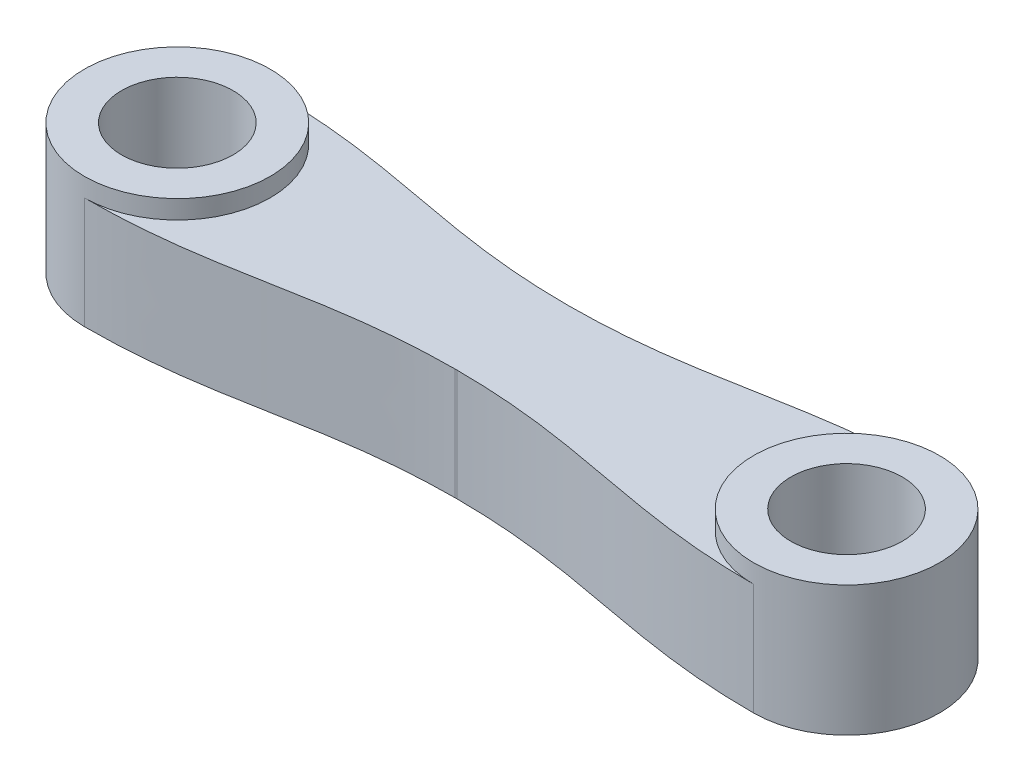
ISO-10303-21;
HEADER;
FILE_DESCRIPTION(('STEP AP214'),'2;1');
FILE_NAME('part.step','',(''),(''),'','','');
FILE_SCHEMA(('AUTOMOTIVE_DESIGN { 1 0 10303 214 1 1 1 1 }'));
ENDSEC;
DATA;
#1=APPLICATION_CONTEXT('core data for automotive mechanical design processes');
#2=APPLICATION_PROTOCOL_DEFINITION('international standard','automotive_design',2000,#1);
#3=PRODUCT_CONTEXT('',#1,'mechanical');
#4=PRODUCT('Part','Part','',(#3));
#5=PRODUCT_RELATED_PRODUCT_CATEGORY('part','',(#4));
#6=PRODUCT_DEFINITION_FORMATION('','',#4);
#7=PRODUCT_DEFINITION_CONTEXT('part definition',#1,'design');
#8=PRODUCT_DEFINITION('design','',#6,#7);
#9=PRODUCT_DEFINITION_SHAPE('','',#8);
#10=(LENGTH_UNIT() NAMED_UNIT(*) SI_UNIT(.MILLI.,.METRE.));
#11=(NAMED_UNIT(*) PLANE_ANGLE_UNIT() SI_UNIT($,.RADIAN.));
#12=(NAMED_UNIT(*) SI_UNIT($,.STERADIAN.) SOLID_ANGLE_UNIT());
#13=UNCERTAINTY_MEASURE_WITH_UNIT(LENGTH_MEASURE(1.E-05),#10,'distance_accuracy_value','');
#14=(GEOMETRIC_REPRESENTATION_CONTEXT(3) GLOBAL_UNCERTAINTY_ASSIGNED_CONTEXT((#13)) GLOBAL_UNIT_ASSIGNED_CONTEXT((#10,
#11,#12)) REPRESENTATION_CONTEXT('',''));
#15=CARTESIAN_POINT('',(0.,0.,0.));
#16=DIRECTION('',(0.,0.,1.));
#17=DIRECTION('',(1.,0.,0.));
#18=AXIS2_PLACEMENT_3D('',#15,#16,#17);
#19=CARTESIAN_POINT('',(-9.,3.5,0.));
#20=DIRECTION('',(0.,-1.,0.));
#21=DIRECTION('',(0.,0.,-1.));
#22=AXIS2_PLACEMENT_3D('',#19,#20,#21);
#23=CYLINDRICAL_SURFACE('',#22,2.5);
#24=CARTESIAN_POINT('',(-9.,3.5,0.));
#25=DIRECTION('',(0.,1.,0.));
#26=DIRECTION('',(0.,0.,1.));
#27=AXIS2_PLACEMENT_3D('',#24,#25,#26);
#28=CIRCLE('',#27,2.5);
#29=CARTESIAN_POINT('',(-9.,3.5,2.5));
#30=VERTEX_POINT('',#29);
#31=EDGE_CURVE('E202',#30,#30,#28,.T.);
#32=ORIENTED_EDGE('',*,*,#31,.F.);
#33=EDGE_LOOP('',(#32));
#34=FACE_BOUND('',#33,.T.);
#35=DIRECTION('',(0.,-1.,0.));
#36=VECTOR('',#35,1.);
#37=CARTESIAN_POINT('',(-9.,3.,2.5));
#38=LINE('',#37,#36);
#39=CARTESIAN_POINT('',(-9.,3.,2.5));
#40=VERTEX_POINT('',#39);
#41=CARTESIAN_POINT('',(-9.,0.,2.5));
#42=VERTEX_POINT('',#41);
#43=EDGE_CURVE('E121',#40,#42,#38,.T.);
#44=ORIENTED_EDGE('',*,*,#43,.F.);
#45=CARTESIAN_POINT('',(-9.,3.,0.));
#46=DIRECTION('',(0.,1.,0.));
#47=DIRECTION('',(0.,0.,1.));
#48=AXIS2_PLACEMENT_3D('',#45,#46,#47);
#49=CIRCLE('',#48,2.5);
#50=CARTESIAN_POINT('',(-9.,3.,-2.5));
#51=VERTEX_POINT('',#50);
#52=EDGE_CURVE('E164',#40,#51,#49,.T.);
#53=ORIENTED_EDGE('',*,*,#52,.T.);
#54=DIRECTION('',(0.,-1.,0.));
#55=VECTOR('',#54,1.);
#56=CARTESIAN_POINT('',(-9.,3.,-2.5));
#57=LINE('',#56,#55);
#58=CARTESIAN_POINT('',(-9.,0.,-2.5));
#59=VERTEX_POINT('',#58);
#60=EDGE_CURVE('E231',#51,#59,#57,.T.);
#61=ORIENTED_EDGE('',*,*,#60,.T.);
#62=CARTESIAN_POINT('',(-9.,0.,0.));
#63=DIRECTION('',(0.,1.,0.));
#64=DIRECTION('',(0.,0.,1.));
#65=AXIS2_PLACEMENT_3D('',#62,#63,#64);
#66=CIRCLE('',#65,2.5);
#67=EDGE_CURVE('E205',#59,#42,#66,.T.);
#68=ORIENTED_EDGE('',*,*,#67,.T.);
#69=EDGE_LOOP('',(#44,#53,#61,#68));
#70=FACE_BOUND('',#69,.T.);
#71=ADVANCED_FACE('F35',(#34,#70),#23,.T.);
#72=CARTESIAN_POINT('',(0.,3.5,0.));
#73=DIRECTION('',(0.,1.,0.));
#74=DIRECTION('',(0.,0.,1.));
#75=AXIS2_PLACEMENT_3D('',#72,#73,#74);
#76=PLANE('',#75);
#77=CARTESIAN_POINT('',(-9.,3.5,0.));
#78=DIRECTION('',(0.,1.,0.));
#79=DIRECTION('',(0.,0.,1.));
#80=AXIS2_PLACEMENT_3D('',#77,#78,#79);
#81=CIRCLE('',#80,1.5);
#82=CARTESIAN_POINT('',(-9.,3.5,1.5));
#83=VERTEX_POINT('',#82);
#84=EDGE_CURVE('E183',#83,#83,#81,.T.);
#85=ORIENTED_EDGE('',*,*,#84,.F.);
#86=EDGE_LOOP('',(#85));
#87=FACE_BOUND('',#86,.T.);
#88=ORIENTED_EDGE('',*,*,#31,.T.);
#89=EDGE_LOOP('',(#88));
#90=FACE_BOUND('',#89,.T.);
#91=ADVANCED_FACE('F158',(#87,#90),#76,.T.);
#92=CARTESIAN_POINT('',(0.,0.,0.));
#93=DIRECTION('',(0.,1.,0.));
#94=DIRECTION('',(0.,0.,1.));
#95=AXIS2_PLACEMENT_3D('',#92,#93,#94);
#96=PLANE('',#95);
#97=CARTESIAN_POINT('',(-9.,0.,0.));
#98=DIRECTION('',(0.,1.,0.));
#99=DIRECTION('',(0.,0.,1.));
#100=AXIS2_PLACEMENT_3D('',#97,#98,#99);
#101=CIRCLE('',#100,1.5);
#102=CARTESIAN_POINT('',(-9.,0.,1.5));
#103=VERTEX_POINT('',#102);
#104=EDGE_CURVE('E173',#103,#103,#101,.T.);
#105=ORIENTED_EDGE('',*,*,#104,.T.);
#106=EDGE_LOOP('',(#105));
#107=FACE_BOUND('',#106,.T.);
#108=CARTESIAN_POINT('',(9.,0.,0.));
#109=DIRECTION('',(0.,1.,0.));
#110=DIRECTION('',(0.,0.,-1.));
#111=AXIS2_PLACEMENT_3D('',#108,#109,#110);
#112=CIRCLE('',#111,1.5);
#113=CARTESIAN_POINT('',(9.,0.,-1.5));
#114=VERTEX_POINT('',#113);
#115=EDGE_CURVE('E180',#114,#114,#112,.T.);
#116=ORIENTED_EDGE('',*,*,#115,.T.);
#117=EDGE_LOOP('',(#116));
#118=FACE_BOUND('',#117,.T.);
#119=ORIENTED_EDGE('',*,*,#67,.F.);
#120=CARTESIAN_POINT('',(-9.,0.,-2.5));
#121=CARTESIAN_POINT('',(-5.42583167928752,0.,-2.5));
#122=CARTESIAN_POINT('',(-3.59903871905224,0.,-1.50458369189798));
#123=CARTESIAN_POINT('',(0.,0.,-1.5));
#124=B_SPLINE_CURVE_WITH_KNOTS('',3,(#120,#121,#122,#123),.UNSPECIFIED.,.F.,.F.,(4,4),(0.,1.),.UNSPECIFIED.);
#125=CARTESIAN_POINT('',(-0.0260821857573528,0.,-1.50005061650803));
#126=VERTEX_POINT('',#125);
#127=EDGE_CURVE('E169',#59,#126,#124,.T.);
#128=ORIENTED_EDGE('',*,*,#127,.T.);
#129=CARTESIAN_POINT('',(0.,0.,-11.5000166024295));
#130=DIRECTION('',(0.,1.,0.));
#131=DIRECTION('',(0.,0.,1.));
#132=AXIS2_PLACEMENT_3D('',#129,#130,#131);
#133=CIRCLE('',#132,10.);
#134=CARTESIAN_POINT('',(0.0260821857573516,0.,-1.50005061650803));
#135=VERTEX_POINT('',#134);
#136=EDGE_CURVE('E217',#126,#135,#133,.T.);
#137=ORIENTED_EDGE('',*,*,#136,.T.);
#138=CARTESIAN_POINT('',(9.,0.,-2.5));
#139=CARTESIAN_POINT('',(5.42583167928752,0.,-2.5));
#140=CARTESIAN_POINT('',(3.59903871905224,0.,-1.50458369189798));
#141=CARTESIAN_POINT('',(0.,0.,-1.5));
#142=B_SPLINE_CURVE_WITH_KNOTS('',3,(#138,#139,#140,#141),.UNSPECIFIED.,.F.,.F.,(4,4),(0.,1.),.UNSPECIFIED.);
#143=CARTESIAN_POINT('',(9.,0.,-2.5));
#144=VERTEX_POINT('',#143);
#145=EDGE_CURVE('E235',#144,#135,#142,.T.);
#146=ORIENTED_EDGE('',*,*,#145,.F.);
#147=CARTESIAN_POINT('',(9.,0.,0.));
#148=DIRECTION('',(0.,1.,0.));
#149=DIRECTION('',(0.,0.,1.));
#150=AXIS2_PLACEMENT_3D('',#147,#148,#149);
#151=CIRCLE('',#150,2.5);
#152=CARTESIAN_POINT('',(9.,0.,2.5));
#153=VERTEX_POINT('',#152);
#154=EDGE_CURVE('E170',#153,#144,#151,.T.);
#155=ORIENTED_EDGE('',*,*,#154,.F.);
#156=CARTESIAN_POINT('',(9.,0.,2.5));
#157=CARTESIAN_POINT('',(5.42583167928752,0.,2.5));
#158=CARTESIAN_POINT('',(3.59903871905224,0.,1.50458369189798));
#159=CARTESIAN_POINT('',(0.,0.,1.5));
#160=B_SPLINE_CURVE_WITH_KNOTS('',3,(#156,#157,#158,#159),.UNSPECIFIED.,.F.,.F.,(4,4),(0.,1.),.UNSPECIFIED.);
#161=CARTESIAN_POINT('',(0.0260821857573528,0.,1.50005061650803));
#162=VERTEX_POINT('',#161);
#163=EDGE_CURVE('E117',#153,#162,#160,.T.);
#164=ORIENTED_EDGE('',*,*,#163,.T.);
#165=CARTESIAN_POINT('',(0.,0.,11.5000166024295));
#166=DIRECTION('',(0.,1.,0.));
#167=DIRECTION('',(0.,0.,1.));
#168=AXIS2_PLACEMENT_3D('',#165,#166,#167);
#169=CIRCLE('',#168,10.);
#170=CARTESIAN_POINT('',(-0.0260821857573409,0.,1.50005061650803));
#171=VERTEX_POINT('',#170);
#172=EDGE_CURVE('E43',#162,#171,#169,.T.);
#173=ORIENTED_EDGE('',*,*,#172,.T.);
#174=CARTESIAN_POINT('',(-9.,0.,2.5));
#175=CARTESIAN_POINT('',(-5.42583167928752,0.,2.5));
#176=CARTESIAN_POINT('',(-3.59903871905224,0.,1.50458369189798));
#177=CARTESIAN_POINT('',(0.,0.,1.5));
#178=B_SPLINE_CURVE_WITH_KNOTS('',3,(#174,#175,#176,#177),.UNSPECIFIED.,.F.,.F.,(4,4),(0.,1.),.UNSPECIFIED.);
#179=EDGE_CURVE('E176',#42,#171,#178,.T.);
#180=ORIENTED_EDGE('',*,*,#179,.F.);
#181=EDGE_LOOP('',(#119,#128,#137,#146,#155,#164,#173,#180));
#182=FACE_BOUND('',#181,.T.);
#183=ADVANCED_FACE('F157',(#107,#118,#182),#96,.F.);
#184=CARTESIAN_POINT('',(-9.,3.,2.5));
#185=CARTESIAN_POINT('',(-5.42583167928752,3.,2.5));
#186=CARTESIAN_POINT('',(-3.59903871905224,3.,1.50458369189798));
#187=CARTESIAN_POINT('',(0.,3.,1.5));
#188=B_SPLINE_CURVE_WITH_KNOTS('',3,(#184,#185,#186,#187),.UNSPECIFIED.,.F.,.F.,(4,4),(0.,1.),.UNSPECIFIED.);
#189=DIRECTION('',(0.,-1.,0.));
#190=VECTOR('',#189,1.);
#191=SURFACE_OF_LINEAR_EXTRUSION('',#188,#190);
#192=ORIENTED_EDGE('',*,*,#179,.T.);
#193=DIRECTION('',(0.,-1.,0.));
#194=VECTOR('',#193,1.);
#195=CARTESIAN_POINT('',(-0.0260821857573409,0.,1.50005061650803));
#196=LINE('',#195,#194);
#197=CARTESIAN_POINT('',(-0.0260821857573409,3.,1.50005061650803));
#198=VERTEX_POINT('',#197);
#199=EDGE_CURVE('E50',#171,#198,#196,.F.);
#200=ORIENTED_EDGE('',*,*,#199,.T.);
#201=EDGE_CURVE('E112',#40,#198,#188,.T.);
#202=ORIENTED_EDGE('',*,*,#201,.F.);
#203=ORIENTED_EDGE('',*,*,#43,.T.);
#204=EDGE_LOOP('',(#192,#200,#202,#203));
#205=FACE_BOUND('',#204,.T.);
#206=ADVANCED_FACE('F154',(#205),#191,.F.);
#207=CARTESIAN_POINT('',(9.,3.,2.5));
#208=CARTESIAN_POINT('',(5.42583167928752,3.,2.5));
#209=CARTESIAN_POINT('',(3.59903871905224,3.,1.50458369189798));
#210=CARTESIAN_POINT('',(0.,3.,1.5));
#211=B_SPLINE_CURVE_WITH_KNOTS('',3,(#207,#208,#209,#210),.UNSPECIFIED.,.F.,.F.,(4,4),(0.,1.),.UNSPECIFIED.);
#212=DIRECTION('',(0.,-1.,0.));
#213=VECTOR('',#212,1.);
#214=SURFACE_OF_LINEAR_EXTRUSION('',#211,#213);
#215=CARTESIAN_POINT('',(9.,3.,2.5));
#216=VERTEX_POINT('',#215);
#217=CARTESIAN_POINT('',(0.0260821857573528,3.,1.50005061650803));
#218=VERTEX_POINT('',#217);
#219=EDGE_CURVE('E100',#216,#218,#211,.T.);
#220=ORIENTED_EDGE('',*,*,#219,.T.);
#221=DIRECTION('',(0.,-1.,0.));
#222=VECTOR('',#221,1.);
#223=CARTESIAN_POINT('',(0.0260821857573528,3.,1.50005061650803));
#224=LINE('',#223,#222);
#225=EDGE_CURVE('E214',#218,#162,#224,.T.);
#226=ORIENTED_EDGE('',*,*,#225,.T.);
#227=ORIENTED_EDGE('',*,*,#163,.F.);
#228=DIRECTION('',(0.,-1.,0.));
#229=VECTOR('',#228,1.);
#230=CARTESIAN_POINT('',(9.,3.,2.5));
#231=LINE('',#230,#229);
#232=EDGE_CURVE('E115',#216,#153,#231,.T.);
#233=ORIENTED_EDGE('',*,*,#232,.F.);
#234=EDGE_LOOP('',(#220,#226,#227,#233));
#235=FACE_BOUND('',#234,.T.);
#236=ADVANCED_FACE('F116',(#235),#214,.T.);
#237=CARTESIAN_POINT('',(9.,3.,-2.5));
#238=CARTESIAN_POINT('',(5.42583167928752,3.,-2.5));
#239=CARTESIAN_POINT('',(3.59903871905224,3.,-1.50458369189798));
#240=CARTESIAN_POINT('',(0.,3.,-1.5));
#241=B_SPLINE_CURVE_WITH_KNOTS('',3,(#237,#238,#239,#240),.UNSPECIFIED.,.F.,.F.,(4,4),(0.,1.),.UNSPECIFIED.);
#242=DIRECTION('',(0.,-1.,0.));
#243=VECTOR('',#242,1.);
#244=SURFACE_OF_LINEAR_EXTRUSION('',#241,#243);
#245=ORIENTED_EDGE('',*,*,#145,.T.);
#246=DIRECTION('',(0.,-1.,0.));
#247=VECTOR('',#246,1.);
#248=CARTESIAN_POINT('',(0.0260821857573516,0.,-1.50005061650803));
#249=LINE('',#248,#247);
#250=CARTESIAN_POINT('',(0.0260821857573516,3.,-1.50005061650803));
#251=VERTEX_POINT('',#250);
#252=EDGE_CURVE('E208',#135,#251,#249,.F.);
#253=ORIENTED_EDGE('',*,*,#252,.T.);
#254=CARTESIAN_POINT('',(9.,3.,-2.5));
#255=VERTEX_POINT('',#254);
#256=EDGE_CURVE('E125',#255,#251,#241,.T.);
#257=ORIENTED_EDGE('',*,*,#256,.F.);
#258=DIRECTION('',(0.,-1.,0.));
#259=VECTOR('',#258,1.);
#260=CARTESIAN_POINT('',(9.,3.,-2.5));
#261=LINE('',#260,#259);
#262=EDGE_CURVE('E122',#255,#144,#261,.T.);
#263=ORIENTED_EDGE('',*,*,#262,.T.);
#264=EDGE_LOOP('',(#245,#253,#257,#263));
#265=FACE_BOUND('',#264,.T.);
#266=ADVANCED_FACE('F145',(#265),#244,.F.);
#267=CARTESIAN_POINT('',(-9.,3.,-2.5));
#268=CARTESIAN_POINT('',(-5.42583167928752,3.,-2.5));
#269=CARTESIAN_POINT('',(-3.59903871905224,3.,-1.50458369189798));
#270=CARTESIAN_POINT('',(0.,3.,-1.5));
#271=B_SPLINE_CURVE_WITH_KNOTS('',3,(#267,#268,#269,#270),.UNSPECIFIED.,.F.,.F.,(4,4),(0.,1.),.UNSPECIFIED.);
#272=DIRECTION('',(0.,-1.,0.));
#273=VECTOR('',#272,1.);
#274=SURFACE_OF_LINEAR_EXTRUSION('',#271,#273);
#275=CARTESIAN_POINT('',(-0.0260821857573528,3.,-1.50005061650803));
#276=VERTEX_POINT('',#275);
#277=EDGE_CURVE('E127',#51,#276,#271,.T.);
#278=ORIENTED_EDGE('',*,*,#277,.T.);
#279=DIRECTION('',(0.,-1.,0.));
#280=VECTOR('',#279,1.);
#281=CARTESIAN_POINT('',(-0.0260821857573528,3.,-1.50005061650803));
#282=LINE('',#281,#280);
#283=EDGE_CURVE('E204',#276,#126,#282,.T.);
#284=ORIENTED_EDGE('',*,*,#283,.T.);
#285=ORIENTED_EDGE('',*,*,#127,.F.);
#286=ORIENTED_EDGE('',*,*,#60,.F.);
#287=EDGE_LOOP('',(#278,#284,#285,#286));
#288=FACE_BOUND('',#287,.T.);
#289=ADVANCED_FACE('F149',(#288),#274,.T.);
#290=CARTESIAN_POINT('',(0.,3.,0.));
#291=DIRECTION('',(0.,1.,0.));
#292=DIRECTION('',(0.,0.,1.));
#293=AXIS2_PLACEMENT_3D('',#290,#291,#292);
#294=PLANE('',#293);
#295=ORIENTED_EDGE('',*,*,#52,.F.);
#296=ORIENTED_EDGE('',*,*,#201,.T.);
#297=CARTESIAN_POINT('',(0.,3.,11.5000166024295));
#298=DIRECTION('',(0.,1.,0.));
#299=DIRECTION('',(0.,0.,1.));
#300=AXIS2_PLACEMENT_3D('',#297,#298,#299);
#301=CIRCLE('',#300,10.);
#302=EDGE_CURVE('E11',#198,#218,#301,.F.);
#303=ORIENTED_EDGE('',*,*,#302,.T.);
#304=ORIENTED_EDGE('',*,*,#219,.F.);
#305=CARTESIAN_POINT('',(9.,3.,0.));
#306=DIRECTION('',(0.,1.,0.));
#307=DIRECTION('',(0.,0.,1.));
#308=AXIS2_PLACEMENT_3D('',#305,#306,#307);
#309=CIRCLE('',#308,2.5);
#310=EDGE_CURVE('E106',#255,#216,#309,.T.);
#311=ORIENTED_EDGE('',*,*,#310,.F.);
#312=ORIENTED_EDGE('',*,*,#256,.T.);
#313=CARTESIAN_POINT('',(0.,3.,-11.5000166024295));
#314=DIRECTION('',(0.,1.,0.));
#315=DIRECTION('',(0.,0.,1.));
#316=AXIS2_PLACEMENT_3D('',#313,#314,#315);
#317=CIRCLE('',#316,10.);
#318=EDGE_CURVE('E219',#251,#276,#317,.F.);
#319=ORIENTED_EDGE('',*,*,#318,.T.);
#320=ORIENTED_EDGE('',*,*,#277,.F.);
#321=EDGE_LOOP('',(#295,#296,#303,#304,#311,#312,#319,#320));
#322=FACE_BOUND('',#321,.T.);
#323=ADVANCED_FACE('F103',(#322),#294,.T.);
#324=CARTESIAN_POINT('',(9.,3.5,0.));
#325=DIRECTION('',(0.,-1.,0.));
#326=DIRECTION('',(0.,0.,-1.));
#327=AXIS2_PLACEMENT_3D('',#324,#325,#326);
#328=CYLINDRICAL_SURFACE('',#327,2.5);
#329=CARTESIAN_POINT('',(9.,3.5,0.));
#330=DIRECTION('',(0.,1.,0.));
#331=DIRECTION('',(0.,0.,1.));
#332=AXIS2_PLACEMENT_3D('',#329,#330,#331);
#333=CIRCLE('',#332,2.5);
#334=CARTESIAN_POINT('',(9.,3.5,2.5));
#335=VERTEX_POINT('',#334);
#336=EDGE_CURVE('E172',#335,#335,#333,.T.);
#337=ORIENTED_EDGE('',*,*,#336,.F.);
#338=EDGE_LOOP('',(#337));
#339=FACE_BOUND('',#338,.T.);
#340=ORIENTED_EDGE('',*,*,#310,.T.);
#341=ORIENTED_EDGE('',*,*,#232,.T.);
#342=ORIENTED_EDGE('',*,*,#154,.T.);
#343=ORIENTED_EDGE('',*,*,#262,.F.);
#344=EDGE_LOOP('',(#340,#341,#342,#343));
#345=FACE_BOUND('',#344,.T.);
#346=ADVANCED_FACE('F124',(#339,#345),#328,.T.);
#347=CARTESIAN_POINT('',(0.,3.5,0.));
#348=DIRECTION('',(0.,1.,0.));
#349=DIRECTION('',(0.,0.,1.));
#350=AXIS2_PLACEMENT_3D('',#347,#348,#349);
#351=PLANE('',#350);
#352=CARTESIAN_POINT('',(9.,3.5,0.));
#353=DIRECTION('',(0.,1.,0.));
#354=DIRECTION('',(0.,0.,-1.));
#355=AXIS2_PLACEMENT_3D('',#352,#353,#354);
#356=CIRCLE('',#355,1.5);
#357=CARTESIAN_POINT('',(9.,3.5,-1.5));
#358=VERTEX_POINT('',#357);
#359=EDGE_CURVE('E177',#358,#358,#356,.T.);
#360=ORIENTED_EDGE('',*,*,#359,.F.);
#361=EDGE_LOOP('',(#360));
#362=FACE_BOUND('',#361,.T.);
#363=ORIENTED_EDGE('',*,*,#336,.T.);
#364=EDGE_LOOP('',(#363));
#365=FACE_BOUND('',#364,.T.);
#366=ADVANCED_FACE('F263',(#362,#365),#351,.T.);
#367=CARTESIAN_POINT('',(0.,1.5,-11.5000166024295));
#368=DIRECTION('',(0.,-1.,0.));
#369=DIRECTION('',(0.,0.,-1.));
#370=AXIS2_PLACEMENT_3D('',#367,#368,#369);
#371=CYLINDRICAL_SURFACE('',#370,10.);
#372=ORIENTED_EDGE('',*,*,#318,.F.);
#373=ORIENTED_EDGE('',*,*,#252,.F.);
#374=ORIENTED_EDGE('',*,*,#136,.F.);
#375=ORIENTED_EDGE('',*,*,#283,.F.);
#376=EDGE_LOOP('',(#372,#373,#374,#375));
#377=FACE_BOUND('',#376,.T.);
#378=ADVANCED_FACE('F232',(#377),#371,.F.);
#379=CARTESIAN_POINT('',(0.,1.5,11.5000166024295));
#380=DIRECTION('',(0.,-1.,0.));
#381=DIRECTION('',(0.,0.,-1.));
#382=AXIS2_PLACEMENT_3D('',#379,#380,#381);
#383=CYLINDRICAL_SURFACE('',#382,10.);
#384=ORIENTED_EDGE('',*,*,#302,.F.);
#385=ORIENTED_EDGE('',*,*,#199,.F.);
#386=ORIENTED_EDGE('',*,*,#172,.F.);
#387=ORIENTED_EDGE('',*,*,#225,.F.);
#388=EDGE_LOOP('',(#384,#385,#386,#387));
#389=FACE_BOUND('',#388,.T.);
#390=ADVANCED_FACE('F37',(#389),#383,.F.);
#391=CARTESIAN_POINT('',(9.,0.,0.));
#392=DIRECTION('',(0.,1.,0.));
#393=DIRECTION('',(0.,0.,1.));
#394=AXIS2_PLACEMENT_3D('',#391,#392,#393);
#395=CYLINDRICAL_SURFACE('',#394,1.5);
#396=ORIENTED_EDGE('',*,*,#115,.F.);
#397=EDGE_LOOP('',(#396));
#398=FACE_BOUND('',#397,.T.);
#399=ORIENTED_EDGE('',*,*,#359,.T.);
#400=EDGE_LOOP('',(#399));
#401=FACE_BOUND('',#400,.T.);
#402=ADVANCED_FACE('F194',(#398,#401),#395,.F.);
#403=CARTESIAN_POINT('',(-9.,0.,0.));
#404=DIRECTION('',(0.,1.,0.));
#405=DIRECTION('',(0.,0.,1.));
#406=AXIS2_PLACEMENT_3D('',#403,#404,#405);
#407=CYLINDRICAL_SURFACE('',#406,1.5);
#408=ORIENTED_EDGE('',*,*,#104,.F.);
#409=EDGE_LOOP('',(#408));
#410=FACE_BOUND('',#409,.T.);
#411=ORIENTED_EDGE('',*,*,#84,.T.);
#412=EDGE_LOOP('',(#411));
#413=FACE_BOUND('',#412,.T.);
#414=ADVANCED_FACE('F191',(#410,#413),#407,.F.);
#415=CLOSED_SHELL('',(#71,#91,#183,#206,#236,#266,#289,#323,#346,#366,#378,#390,#402,#414));
#416=MANIFOLD_SOLID_BREP('B2',#415);
#417=ADVANCED_BREP_SHAPE_REPRESENTATION('',(#18,#416),#14);
#418=SHAPE_DEFINITION_REPRESENTATION(#9,#417);
ENDSEC;
END-ISO-10303-21;
